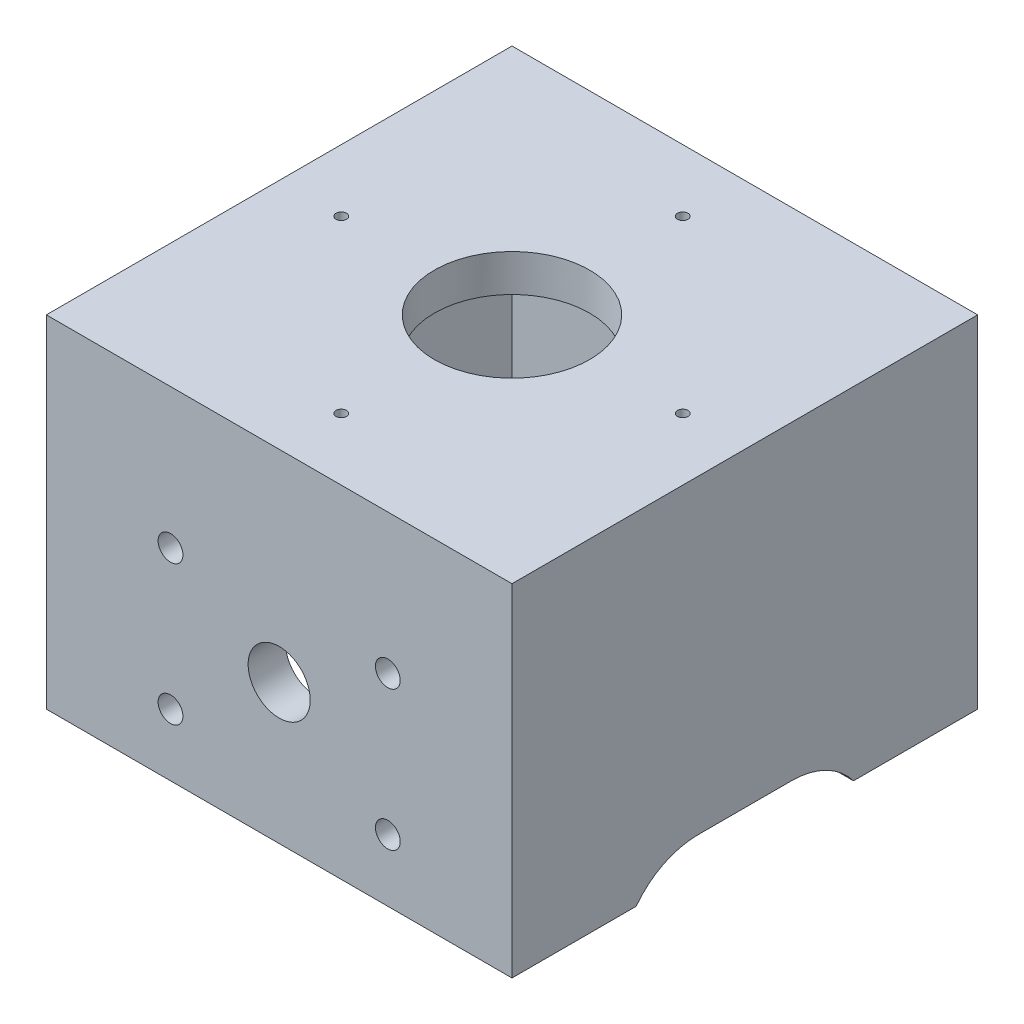
ISO-10303-21;
HEADER;
FILE_DESCRIPTION(('STEP AP214'),'2;1');
FILE_NAME('part.step','',(''),(''),'','','');
FILE_SCHEMA(('AUTOMOTIVE_DESIGN { 1 0 10303 214 1 1 1 1 }'));
ENDSEC;
DATA;
#1=APPLICATION_CONTEXT('core data for automotive mechanical design processes');
#2=APPLICATION_PROTOCOL_DEFINITION('international standard','automotive_design',2000,#1);
#3=PRODUCT_CONTEXT('',#1,'mechanical');
#4=PRODUCT('Part','Part','',(#3));
#5=PRODUCT_RELATED_PRODUCT_CATEGORY('part','',(#4));
#6=PRODUCT_DEFINITION_FORMATION('','',#4);
#7=PRODUCT_DEFINITION_CONTEXT('part definition',#1,'design');
#8=PRODUCT_DEFINITION('design','',#6,#7);
#9=PRODUCT_DEFINITION_SHAPE('','',#8);
#10=(LENGTH_UNIT() NAMED_UNIT(*) SI_UNIT(.MILLI.,.METRE.));
#11=(NAMED_UNIT(*) PLANE_ANGLE_UNIT() SI_UNIT($,.RADIAN.));
#12=(NAMED_UNIT(*) SI_UNIT($,.STERADIAN.) SOLID_ANGLE_UNIT());
#13=UNCERTAINTY_MEASURE_WITH_UNIT(LENGTH_MEASURE(1.E-05),#10,'distance_accuracy_value','');
#14=(GEOMETRIC_REPRESENTATION_CONTEXT(3) GLOBAL_UNCERTAINTY_ASSIGNED_CONTEXT((#13)) GLOBAL_UNIT_ASSIGNED_CONTEXT((#10,
#11,#12)) REPRESENTATION_CONTEXT('',''));
#15=CARTESIAN_POINT('',(0.,0.,0.));
#16=DIRECTION('',(0.,0.,1.));
#17=DIRECTION('',(1.,0.,0.));
#18=AXIS2_PLACEMENT_3D('',#15,#16,#17);
#19=CARTESIAN_POINT('',(0.,0.,0.));
#20=DIRECTION('',(0.,-1.,0.));
#21=DIRECTION('',(0.,0.,-1.));
#22=AXIS2_PLACEMENT_3D('',#19,#20,#21);
#23=PLANE('',#22);
#24=DIRECTION('',(-1.,0.,0.));
#25=VECTOR('',#24,1.);
#26=CARTESIAN_POINT('',(0.,0.,-150.));
#27=LINE('',#26,#25);
#28=CARTESIAN_POINT('',(40.,0.,-150.));
#29=VERTEX_POINT('',#28);
#30=CARTESIAN_POINT('',(0.,0.,-150.));
#31=VERTEX_POINT('',#30);
#32=EDGE_CURVE('E198',#29,#31,#27,.T.);
#33=ORIENTED_EDGE('',*,*,#32,.F.);
#34=DIRECTION('',(0.,0.,-1.));
#35=VECTOR('',#34,1.);
#36=CARTESIAN_POINT('',(40.,0.,-67.2893218813452));
#37=LINE('',#36,#35);
#38=CARTESIAN_POINT('',(40.,0.,-138.));
#39=VERTEX_POINT('',#38);
#40=EDGE_CURVE('E179',#39,#29,#37,.T.);
#41=ORIENTED_EDGE('',*,*,#40,.F.);
#42=DIRECTION('',(1.,0.,0.));
#43=VECTOR('',#42,1.);
#44=CARTESIAN_POINT('',(12.,0.,-138.));
#45=LINE('',#44,#43);
#46=CARTESIAN_POINT('',(12.,0.,-138.));
#47=VERTEX_POINT('',#46);
#48=EDGE_CURVE('E349',#47,#39,#45,.T.);
#49=ORIENTED_EDGE('',*,*,#48,.F.);
#50=DIRECTION('',(0.,0.,-1.));
#51=VECTOR('',#50,1.);
#52=CARTESIAN_POINT('',(12.,0.,-12.));
#53=LINE('',#52,#51);
#54=CARTESIAN_POINT('',(12.,0.,-110.));
#55=VERTEX_POINT('',#54);
#56=EDGE_CURVE('E261',#55,#47,#53,.T.);
#57=ORIENTED_EDGE('',*,*,#56,.F.);
#58=DIRECTION('',(-1.,0.,0.));
#59=VECTOR('',#58,1.);
#60=CARTESIAN_POINT('',(150.,0.,-110.));
#61=LINE('',#60,#59);
#62=CARTESIAN_POINT('',(0.,0.,-110.));
#63=VERTEX_POINT('',#62);
#64=EDGE_CURVE('E305',#55,#63,#61,.T.);
#65=ORIENTED_EDGE('',*,*,#64,.T.);
#66=DIRECTION('',(0.,0.,1.));
#67=VECTOR('',#66,1.);
#68=CARTESIAN_POINT('',(0.,0.,0.));
#69=LINE('',#68,#67);
#70=EDGE_CURVE('E209',#31,#63,#69,.T.);
#71=ORIENTED_EDGE('',*,*,#70,.F.);
#72=EDGE_LOOP('',(#33,#41,#49,#57,#65,#71));
#73=FACE_BOUND('',#72,.T.);
#74=ADVANCED_FACE('F41',(#73),#23,.T.);
#75=CARTESIAN_POINT('',(110.,0.,-138.));
#76=VERTEX_POINT('',#75);
#77=CARTESIAN_POINT('',(138.,0.,-138.));
#78=VERTEX_POINT('',#77);
#79=EDGE_CURVE('E348',#76,#78,#45,.T.);
#80=ORIENTED_EDGE('',*,*,#79,.F.);
#81=DIRECTION('',(0.,0.,-1.));
#82=VECTOR('',#81,1.);
#83=CARTESIAN_POINT('',(110.,0.,-67.2893218813452));
#84=LINE('',#83,#82);
#85=CARTESIAN_POINT('',(110.,0.,-150.));
#86=VERTEX_POINT('',#85);
#87=EDGE_CURVE('E193',#76,#86,#84,.T.);
#88=ORIENTED_EDGE('',*,*,#87,.T.);
#89=CARTESIAN_POINT('',(150.,0.,-150.));
#90=VERTEX_POINT('',#89);
#91=EDGE_CURVE('E211',#90,#86,#27,.T.);
#92=ORIENTED_EDGE('',*,*,#91,.F.);
#93=DIRECTION('',(0.,0.,-1.));
#94=VECTOR('',#93,1.);
#95=CARTESIAN_POINT('',(150.,0.,0.));
#96=LINE('',#95,#94);
#97=CARTESIAN_POINT('',(150.,0.,-110.));
#98=VERTEX_POINT('',#97);
#99=EDGE_CURVE('E219',#98,#90,#96,.T.);
#100=ORIENTED_EDGE('',*,*,#99,.F.);
#101=CARTESIAN_POINT('',(138.,0.,-110.));
#102=VERTEX_POINT('',#101);
#103=EDGE_CURVE('E303',#98,#102,#61,.T.);
#104=ORIENTED_EDGE('',*,*,#103,.T.);
#105=DIRECTION('',(0.,0.,1.));
#106=VECTOR('',#105,1.);
#107=CARTESIAN_POINT('',(138.,0.,-138.));
#108=LINE('',#107,#106);
#109=EDGE_CURVE('E353',#78,#102,#108,.T.);
#110=ORIENTED_EDGE('',*,*,#109,.F.);
#111=EDGE_LOOP('',(#80,#88,#92,#100,#104,#110));
#112=FACE_BOUND('',#111,.T.);
#113=ADVANCED_FACE('F405',(#112),#23,.T.);
#114=CARTESIAN_POINT('',(0.,110.,-150.));
#115=DIRECTION('',(0.,0.,1.));
#116=DIRECTION('',(1.,0.,0.));
#117=AXIS2_PLACEMENT_3D('',#114,#115,#116);
#118=PLANE('',#117);
#119=CARTESIAN_POINT('',(60.,-15.,-150.));
#120=DIRECTION('',(0.,0.,1.));
#121=DIRECTION('',(1.,0.,0.));
#122=AXIS2_PLACEMENT_3D('',#119,#120,#121);
#123=CIRCLE('',#122,25.);
#124=CARTESIAN_POINT('',(60.,9.99999999999999,-150.));
#125=VERTEX_POINT('',#124);
#126=EDGE_CURVE('E183',#125,#29,#123,.T.);
#127=ORIENTED_EDGE('',*,*,#126,.T.);
#128=ORIENTED_EDGE('',*,*,#32,.T.);
#129=DIRECTION('',(0.,-1.,0.));
#130=VECTOR('',#129,1.);
#131=CARTESIAN_POINT('',(0.,110.,-150.));
#132=LINE('',#131,#130);
#133=CARTESIAN_POINT('',(0.,110.,-150.));
#134=VERTEX_POINT('',#133);
#135=EDGE_CURVE('E223',#134,#31,#132,.T.);
#136=ORIENTED_EDGE('',*,*,#135,.F.);
#137=DIRECTION('',(-1.,0.,0.));
#138=VECTOR('',#137,1.);
#139=CARTESIAN_POINT('',(0.,110.,-150.));
#140=LINE('',#139,#138);
#141=CARTESIAN_POINT('',(150.,110.,-150.));
#142=VERTEX_POINT('',#141);
#143=EDGE_CURVE('E227',#142,#134,#140,.T.);
#144=ORIENTED_EDGE('',*,*,#143,.F.);
#145=DIRECTION('',(0.,-1.,0.));
#146=VECTOR('',#145,1.);
#147=CARTESIAN_POINT('',(150.,110.,-150.));
#148=LINE('',#147,#146);
#149=EDGE_CURVE('E226',#142,#90,#148,.T.);
#150=ORIENTED_EDGE('',*,*,#149,.T.);
#151=ORIENTED_EDGE('',*,*,#91,.T.);
#152=CARTESIAN_POINT('',(90.,-15.,-150.));
#153=DIRECTION('',(0.,0.,1.));
#154=DIRECTION('',(1.,0.,0.));
#155=AXIS2_PLACEMENT_3D('',#152,#153,#154);
#156=CIRCLE('',#155,25.);
#157=CARTESIAN_POINT('',(90.,10.,-150.));
#158=VERTEX_POINT('',#157);
#159=EDGE_CURVE('E203',#86,#158,#156,.T.);
#160=ORIENTED_EDGE('',*,*,#159,.T.);
#161=DIRECTION('',(1.,0.,0.));
#162=VECTOR('',#161,1.);
#163=CARTESIAN_POINT('',(0.,9.99999999999994,-150.));
#164=LINE('',#163,#162);
#165=EDGE_CURVE('E201',#125,#158,#164,.T.);
#166=ORIENTED_EDGE('',*,*,#165,.F.);
#167=EDGE_LOOP('',(#127,#128,#136,#144,#150,#151,#160,#166));
#168=FACE_BOUND('',#167,.T.);
#169=ADVANCED_FACE('F196',(#168),#118,.F.);
#170=CARTESIAN_POINT('',(12.,288.19090885901,-138.));
#171=DIRECTION('',(0.,0.,-1.));
#172=DIRECTION('',(-1.,0.,0.));
#173=AXIS2_PLACEMENT_3D('',#170,#171,#172);
#174=PLANE('',#173);
#175=CARTESIAN_POINT('',(60.,-15.,-138.));
#176=DIRECTION('',(0.,0.,-1.));
#177=DIRECTION('',(-1.,0.,0.));
#178=AXIS2_PLACEMENT_3D('',#175,#176,#177);
#179=CIRCLE('',#178,25.);
#180=CARTESIAN_POINT('',(60.,9.99999999999999,-138.));
#181=VERTEX_POINT('',#180);
#182=EDGE_CURVE('E186',#39,#181,#179,.T.);
#183=ORIENTED_EDGE('',*,*,#182,.T.);
#184=DIRECTION('',(-1.,0.,0.));
#185=VECTOR('',#184,1.);
#186=CARTESIAN_POINT('',(0.,9.99999999999994,-138.));
#187=LINE('',#186,#185);
#188=CARTESIAN_POINT('',(90.,10.,-138.));
#189=VERTEX_POINT('',#188);
#190=EDGE_CURVE('E416',#189,#181,#187,.T.);
#191=ORIENTED_EDGE('',*,*,#190,.F.);
#192=CARTESIAN_POINT('',(90.,-15.,-138.));
#193=DIRECTION('',(0.,0.,-1.));
#194=DIRECTION('',(-1.,0.,0.));
#195=AXIS2_PLACEMENT_3D('',#192,#193,#194);
#196=CIRCLE('',#195,25.);
#197=EDGE_CURVE('E192',#189,#76,#196,.T.);
#198=ORIENTED_EDGE('',*,*,#197,.T.);
#199=ORIENTED_EDGE('',*,*,#79,.T.);
#200=DIRECTION('',(0.,-1.,0.));
#201=VECTOR('',#200,1.);
#202=CARTESIAN_POINT('',(138.,288.19090885901,-138.));
#203=LINE('',#202,#201);
#204=CARTESIAN_POINT('',(138.,98.,-138.));
#205=VERTEX_POINT('',#204);
#206=EDGE_CURVE('E367',#205,#78,#203,.T.);
#207=ORIENTED_EDGE('',*,*,#206,.F.);
#208=DIRECTION('',(-1.,0.,0.));
#209=VECTOR('',#208,1.);
#210=CARTESIAN_POINT('',(12.,98.,-138.));
#211=LINE('',#210,#209);
#212=CARTESIAN_POINT('',(12.,98.,-138.));
#213=VERTEX_POINT('',#212);
#214=EDGE_CURVE('E343',#205,#213,#211,.T.);
#215=ORIENTED_EDGE('',*,*,#214,.T.);
#216=DIRECTION('',(0.,-1.,0.));
#217=VECTOR('',#216,1.);
#218=CARTESIAN_POINT('',(12.,288.19090885901,-138.));
#219=LINE('',#218,#217);
#220=EDGE_CURVE('E360',#213,#47,#219,.T.);
#221=ORIENTED_EDGE('',*,*,#220,.T.);
#222=ORIENTED_EDGE('',*,*,#48,.T.);
#223=EDGE_LOOP('',(#183,#191,#198,#199,#207,#215,#221,#222));
#224=FACE_BOUND('',#223,.T.);
#225=ADVANCED_FACE('F464',(#224),#174,.F.);
#226=CARTESIAN_POINT('',(0.,110.,0.));
#227=DIRECTION('',(1.,0.,0.));
#228=DIRECTION('',(0.,0.,-1.));
#229=AXIS2_PLACEMENT_3D('',#226,#227,#228);
#230=PLANE('',#229);
#231=ORIENTED_EDGE('',*,*,#70,.T.);
#232=CARTESIAN_POINT('',(0.,-15.,-90.));
#233=DIRECTION('',(-1.,0.,0.));
#234=DIRECTION('',(0.,0.,-1.));
#235=AXIS2_PLACEMENT_3D('',#232,#233,#234);
#236=CIRCLE('',#235,25.);
#237=CARTESIAN_POINT('',(0.,10.,-90.));
#238=VERTEX_POINT('',#237);
#239=EDGE_CURVE('E419',#238,#63,#236,.T.);
#240=ORIENTED_EDGE('',*,*,#239,.F.);
#241=DIRECTION('',(0.,0.,-1.));
#242=VECTOR('',#241,1.);
#243=CARTESIAN_POINT('',(0.,10.,-90.));
#244=LINE('',#243,#242);
#245=CARTESIAN_POINT('',(0.,10.,-60.));
#246=VERTEX_POINT('',#245);
#247=EDGE_CURVE('E295',#246,#238,#244,.T.);
#248=ORIENTED_EDGE('',*,*,#247,.F.);
#249=CARTESIAN_POINT('',(0.,-15.,-60.));
#250=DIRECTION('',(-1.,0.,0.));
#251=DIRECTION('',(0.,0.,1.));
#252=AXIS2_PLACEMENT_3D('',#249,#250,#251);
#253=CIRCLE('',#252,25.);
#254=CARTESIAN_POINT('',(0.,0.,-40.));
#255=VERTEX_POINT('',#254);
#256=EDGE_CURVE('E430',#255,#246,#253,.T.);
#257=ORIENTED_EDGE('',*,*,#256,.F.);
#258=CARTESIAN_POINT('',(0.,0.,0.));
#259=VERTEX_POINT('',#258);
#260=EDGE_CURVE('E376',#255,#259,#69,.T.);
#261=ORIENTED_EDGE('',*,*,#260,.T.);
#262=DIRECTION('',(0.,-1.,0.));
#263=VECTOR('',#262,1.);
#264=CARTESIAN_POINT('',(0.,110.,0.));
#265=LINE('',#264,#263);
#266=CARTESIAN_POINT('',(0.,110.,0.));
#267=VERTEX_POINT('',#266);
#268=EDGE_CURVE('E235',#267,#259,#265,.T.);
#269=ORIENTED_EDGE('',*,*,#268,.F.);
#270=DIRECTION('',(0.,0.,1.));
#271=VECTOR('',#270,1.);
#272=CARTESIAN_POINT('',(0.,110.,0.));
#273=LINE('',#272,#271);
#274=EDGE_CURVE('E217',#134,#267,#273,.T.);
#275=ORIENTED_EDGE('',*,*,#274,.F.);
#276=ORIENTED_EDGE('',*,*,#135,.T.);
#277=EDGE_LOOP('',(#231,#240,#248,#257,#261,#269,#275,#276));
#278=FACE_BOUND('',#277,.T.);
#279=ADVANCED_FACE('F43',(#278),#230,.F.);
#280=CARTESIAN_POINT('',(0.,110.,0.));
#281=DIRECTION('',(0.,0.,-1.));
#282=DIRECTION('',(-1.,0.,0.));
#283=AXIS2_PLACEMENT_3D('',#280,#281,#282);
#284=PLANE('',#283);
#285=CARTESIAN_POINT('',(40.,20.,0.));
#286=DIRECTION('',(0.,0.,1.));
#287=DIRECTION('',(1.,0.,0.));
#288=AXIS2_PLACEMENT_3D('',#285,#286,#287);
#289=CIRCLE('',#288,4.);
#290=CARTESIAN_POINT('',(44.,20.,0.));
#291=VERTEX_POINT('',#290);
#292=EDGE_CURVE('E508',#291,#291,#289,.T.);
#293=ORIENTED_EDGE('',*,*,#292,.F.);
#294=EDGE_LOOP('',(#293));
#295=FACE_BOUND('',#294,.T.);
#296=CARTESIAN_POINT('',(110.,20.,0.));
#297=DIRECTION('',(0.,0.,1.));
#298=DIRECTION('',(1.,0.,0.));
#299=AXIS2_PLACEMENT_3D('',#296,#297,#298);
#300=CIRCLE('',#299,4.00000000000001);
#301=CARTESIAN_POINT('',(114.,20.,0.));
#302=VERTEX_POINT('',#301);
#303=EDGE_CURVE('E512',#302,#302,#300,.T.);
#304=ORIENTED_EDGE('',*,*,#303,.F.);
#305=EDGE_LOOP('',(#304));
#306=FACE_BOUND('',#305,.T.);
#307=CARTESIAN_POINT('',(110.,65.,0.));
#308=DIRECTION('',(0.,0.,1.));
#309=DIRECTION('',(1.,0.,0.));
#310=AXIS2_PLACEMENT_3D('',#307,#308,#309);
#311=CIRCLE('',#310,3.99999999999998);
#312=CARTESIAN_POINT('',(114.,65.,0.));
#313=VERTEX_POINT('',#312);
#314=EDGE_CURVE('E516',#313,#313,#311,.T.);
#315=ORIENTED_EDGE('',*,*,#314,.F.);
#316=EDGE_LOOP('',(#315));
#317=FACE_BOUND('',#316,.T.);
#318=CARTESIAN_POINT('',(75.,45.,0.));
#319=DIRECTION('',(0.,0.,1.));
#320=DIRECTION('',(1.,0.,0.));
#321=AXIS2_PLACEMENT_3D('',#318,#319,#320);
#322=CIRCLE('',#321,9.99999999999999);
#323=CARTESIAN_POINT('',(85.,45.,0.));
#324=VERTEX_POINT('',#323);
#325=EDGE_CURVE('E520',#324,#324,#322,.T.);
#326=ORIENTED_EDGE('',*,*,#325,.F.);
#327=EDGE_LOOP('',(#326));
#328=FACE_BOUND('',#327,.T.);
#329=CARTESIAN_POINT('',(40.,65.,0.));
#330=DIRECTION('',(0.,0.,1.));
#331=DIRECTION('',(1.,0.,0.));
#332=AXIS2_PLACEMENT_3D('',#329,#330,#331);
#333=CIRCLE('',#332,4.00000000000001);
#334=CARTESIAN_POINT('',(44.,65.,0.));
#335=VERTEX_POINT('',#334);
#336=EDGE_CURVE('E523',#335,#335,#333,.T.);
#337=ORIENTED_EDGE('',*,*,#336,.F.);
#338=EDGE_LOOP('',(#337));
#339=FACE_BOUND('',#338,.T.);
#340=DIRECTION('',(1.,0.,0.));
#341=VECTOR('',#340,1.);
#342=CARTESIAN_POINT('',(0.,0.,0.));
#343=LINE('',#342,#341);
#344=CARTESIAN_POINT('',(150.,0.,0.));
#345=VERTEX_POINT('',#344);
#346=EDGE_CURVE('E389',#259,#345,#343,.T.);
#347=ORIENTED_EDGE('',*,*,#346,.T.);
#348=DIRECTION('',(0.,-1.,0.));
#349=VECTOR('',#348,1.);
#350=CARTESIAN_POINT('',(150.,110.,0.));
#351=LINE('',#350,#349);
#352=CARTESIAN_POINT('',(150.,110.,0.));
#353=VERTEX_POINT('',#352);
#354=EDGE_CURVE('E231',#353,#345,#351,.T.);
#355=ORIENTED_EDGE('',*,*,#354,.F.);
#356=DIRECTION('',(1.,0.,0.));
#357=VECTOR('',#356,1.);
#358=CARTESIAN_POINT('',(0.,110.,0.));
#359=LINE('',#358,#357);
#360=EDGE_CURVE('E380',#267,#353,#359,.T.);
#361=ORIENTED_EDGE('',*,*,#360,.F.);
#362=ORIENTED_EDGE('',*,*,#268,.T.);
#363=EDGE_LOOP('',(#347,#355,#361,#362));
#364=FACE_BOUND('',#363,.T.);
#365=ADVANCED_FACE('F478',(#295,#306,#317,#328,#339,#364),#284,.F.);
#366=CARTESIAN_POINT('',(150.,110.,0.));
#367=DIRECTION('',(-1.,0.,0.));
#368=DIRECTION('',(0.,0.,1.));
#369=AXIS2_PLACEMENT_3D('',#366,#367,#368);
#370=PLANE('',#369);
#371=DIRECTION('',(0.,0.,-1.));
#372=VECTOR('',#371,1.);
#373=CARTESIAN_POINT('',(150.,10.,-90.));
#374=LINE('',#373,#372);
#375=CARTESIAN_POINT('',(150.,10.,-60.));
#376=VERTEX_POINT('',#375);
#377=CARTESIAN_POINT('',(150.,10.,-90.));
#378=VERTEX_POINT('',#377);
#379=EDGE_CURVE('E426',#376,#378,#374,.T.);
#380=ORIENTED_EDGE('',*,*,#379,.T.);
#381=CARTESIAN_POINT('',(150.,-15.,-90.));
#382=DIRECTION('',(-1.,0.,0.));
#383=DIRECTION('',(0.,0.,-1.));
#384=AXIS2_PLACEMENT_3D('',#381,#382,#383);
#385=CIRCLE('',#384,25.);
#386=EDGE_CURVE('E282',#378,#98,#385,.T.);
#387=ORIENTED_EDGE('',*,*,#386,.T.);
#388=ORIENTED_EDGE('',*,*,#99,.T.);
#389=ORIENTED_EDGE('',*,*,#149,.F.);
#390=DIRECTION('',(0.,0.,-1.));
#391=VECTOR('',#390,1.);
#392=CARTESIAN_POINT('',(150.,110.,0.));
#393=LINE('',#392,#391);
#394=EDGE_CURVE('E383',#353,#142,#393,.T.);
#395=ORIENTED_EDGE('',*,*,#394,.F.);
#396=ORIENTED_EDGE('',*,*,#354,.T.);
#397=CARTESIAN_POINT('',(150.,0.,-40.));
#398=VERTEX_POINT('',#397);
#399=EDGE_CURVE('E212',#345,#398,#96,.T.);
#400=ORIENTED_EDGE('',*,*,#399,.T.);
#401=CARTESIAN_POINT('',(150.,-15.,-60.));
#402=DIRECTION('',(-1.,0.,0.));
#403=DIRECTION('',(0.,0.,1.));
#404=AXIS2_PLACEMENT_3D('',#401,#402,#403);
#405=CIRCLE('',#404,25.);
#406=EDGE_CURVE('E422',#398,#376,#405,.T.);
#407=ORIENTED_EDGE('',*,*,#406,.T.);
#408=EDGE_LOOP('',(#380,#387,#388,#389,#395,#396,#400,#407));
#409=FACE_BOUND('',#408,.T.);
#410=ADVANCED_FACE('F398',(#409),#370,.F.);
#411=CARTESIAN_POINT('',(0.,110.,0.));
#412=DIRECTION('',(0.,-1.,0.));
#413=DIRECTION('',(0.,0.,-1.));
#414=AXIS2_PLACEMENT_3D('',#411,#412,#413);
#415=PLANE('',#414);
#416=CARTESIAN_POINT('',(130.,110.,-75.));
#417=DIRECTION('',(0.,1.,0.));
#418=DIRECTION('',(0.,0.,1.));
#419=AXIS2_PLACEMENT_3D('',#416,#417,#418);
#420=CIRCLE('',#419,1.70000000000001);
#421=CARTESIAN_POINT('',(130.,110.,-73.2999999999999));
#422=VERTEX_POINT('',#421);
#423=EDGE_CURVE('E245',#422,#422,#420,.T.);
#424=ORIENTED_EDGE('',*,*,#423,.F.);
#425=EDGE_LOOP('',(#424));
#426=FACE_BOUND('',#425,.T.);
#427=CARTESIAN_POINT('',(75.,110.,-75.));
#428=DIRECTION('',(0.,1.,0.));
#429=DIRECTION('',(0.,0.,1.));
#430=AXIS2_PLACEMENT_3D('',#427,#428,#429);
#431=CIRCLE('',#430,25.);
#432=CARTESIAN_POINT('',(75.,110.,-50.));
#433=VERTEX_POINT('',#432);
#434=EDGE_CURVE('E314',#433,#433,#431,.T.);
#435=ORIENTED_EDGE('',*,*,#434,.F.);
#436=EDGE_LOOP('',(#435));
#437=FACE_BOUND('',#436,.T.);
#438=CARTESIAN_POINT('',(75.,110.,-19.9999999999999));
#439=DIRECTION('',(0.,1.,0.));
#440=DIRECTION('',(0.,0.,1.));
#441=AXIS2_PLACEMENT_3D('',#438,#439,#440);
#442=CIRCLE('',#441,1.7);
#443=CARTESIAN_POINT('',(75.,110.,-18.2999999999999));
#444=VERTEX_POINT('',#443);
#445=EDGE_CURVE('E319',#444,#444,#442,.T.);
#446=ORIENTED_EDGE('',*,*,#445,.F.);
#447=EDGE_LOOP('',(#446));
#448=FACE_BOUND('',#447,.T.);
#449=CARTESIAN_POINT('',(20.,110.,-75.));
#450=DIRECTION('',(0.,1.,0.));
#451=DIRECTION('',(0.,0.,1.));
#452=AXIS2_PLACEMENT_3D('',#449,#450,#451);
#453=CIRCLE('',#452,1.7);
#454=CARTESIAN_POINT('',(20.,110.,-73.3));
#455=VERTEX_POINT('',#454);
#456=EDGE_CURVE('E323',#455,#455,#453,.T.);
#457=ORIENTED_EDGE('',*,*,#456,.F.);
#458=EDGE_LOOP('',(#457));
#459=FACE_BOUND('',#458,.T.);
#460=CARTESIAN_POINT('',(75.,110.,-130.));
#461=DIRECTION('',(0.,1.,0.));
#462=DIRECTION('',(0.,0.,1.));
#463=AXIS2_PLACEMENT_3D('',#460,#461,#462);
#464=CIRCLE('',#463,1.7);
#465=CARTESIAN_POINT('',(75.,110.,-128.3));
#466=VERTEX_POINT('',#465);
#467=EDGE_CURVE('E318',#466,#466,#464,.T.);
#468=ORIENTED_EDGE('',*,*,#467,.F.);
#469=EDGE_LOOP('',(#468));
#470=FACE_BOUND('',#469,.T.);
#471=ORIENTED_EDGE('',*,*,#274,.T.);
#472=ORIENTED_EDGE('',*,*,#360,.T.);
#473=ORIENTED_EDGE('',*,*,#394,.T.);
#474=ORIENTED_EDGE('',*,*,#143,.T.);
#475=EDGE_LOOP('',(#471,#472,#473,#474));
#476=FACE_BOUND('',#475,.T.);
#477=ADVANCED_FACE('F481',(#426,#437,#448,#459,#470,#476),#415,.F.);
#478=DIRECTION('',(-1.,0.,0.));
#479=VECTOR('',#478,1.);
#480=CARTESIAN_POINT('',(150.,0.,-40.));
#481=LINE('',#480,#479);
#482=CARTESIAN_POINT('',(138.,0.,-40.));
#483=VERTEX_POINT('',#482);
#484=EDGE_CURVE('E299',#398,#483,#481,.T.);
#485=ORIENTED_EDGE('',*,*,#484,.F.);
#486=ORIENTED_EDGE('',*,*,#399,.F.);
#487=ORIENTED_EDGE('',*,*,#346,.F.);
#488=ORIENTED_EDGE('',*,*,#260,.F.);
#489=CARTESIAN_POINT('',(12.,0.,-40.));
#490=VERTEX_POINT('',#489);
#491=EDGE_CURVE('E302',#490,#255,#481,.T.);
#492=ORIENTED_EDGE('',*,*,#491,.F.);
#493=CARTESIAN_POINT('',(12.,0.,-12.));
#494=VERTEX_POINT('',#493);
#495=EDGE_CURVE('E344',#494,#490,#53,.T.);
#496=ORIENTED_EDGE('',*,*,#495,.F.);
#497=DIRECTION('',(-1.,0.,0.));
#498=VECTOR('',#497,1.);
#499=CARTESIAN_POINT('',(138.,0.,-12.));
#500=LINE('',#499,#498);
#501=CARTESIAN_POINT('',(138.,0.,-12.));
#502=VERTEX_POINT('',#501);
#503=EDGE_CURVE('E356',#502,#494,#500,.T.);
#504=ORIENTED_EDGE('',*,*,#503,.F.);
#505=EDGE_CURVE('E352',#483,#502,#108,.T.);
#506=ORIENTED_EDGE('',*,*,#505,.F.);
#507=EDGE_LOOP('',(#485,#486,#487,#488,#492,#496,#504,#506));
#508=FACE_BOUND('',#507,.T.);
#509=ADVANCED_FACE('F454',(#508),#23,.T.);
#510=CARTESIAN_POINT('',(12.,288.19090885901,-12.));
#511=DIRECTION('',(-1.,0.,0.));
#512=DIRECTION('',(0.,0.,1.));
#513=AXIS2_PLACEMENT_3D('',#510,#511,#512);
#514=PLANE('',#513);
#515=DIRECTION('',(0.,0.,-1.));
#516=VECTOR('',#515,1.);
#517=CARTESIAN_POINT('',(12.,10.,-12.));
#518=LINE('',#517,#516);
#519=CARTESIAN_POINT('',(12.,10.,-60.));
#520=VERTEX_POINT('',#519);
#521=CARTESIAN_POINT('',(12.,10.,-90.));
#522=VERTEX_POINT('',#521);
#523=EDGE_CURVE('E291',#520,#522,#518,.T.);
#524=ORIENTED_EDGE('',*,*,#523,.T.);
#525=CARTESIAN_POINT('',(12.,-15.,-90.));
#526=DIRECTION('',(-1.,0.,0.));
#527=DIRECTION('',(0.,0.,1.));
#528=AXIS2_PLACEMENT_3D('',#525,#526,#527);
#529=CIRCLE('',#528,25.);
#530=EDGE_CURVE('E310',#522,#55,#529,.T.);
#531=ORIENTED_EDGE('',*,*,#530,.T.);
#532=ORIENTED_EDGE('',*,*,#56,.T.);
#533=ORIENTED_EDGE('',*,*,#220,.F.);
#534=DIRECTION('',(0.,0.,1.));
#535=VECTOR('',#534,1.);
#536=CARTESIAN_POINT('',(12.,98.,-12.));
#537=LINE('',#536,#535);
#538=CARTESIAN_POINT('',(12.,98.,-12.));
#539=VERTEX_POINT('',#538);
#540=EDGE_CURVE('E340',#213,#539,#537,.T.);
#541=ORIENTED_EDGE('',*,*,#540,.T.);
#542=DIRECTION('',(0.,-1.,0.));
#543=VECTOR('',#542,1.);
#544=CARTESIAN_POINT('',(12.,288.19090885901,-12.));
#545=LINE('',#544,#543);
#546=EDGE_CURVE('E337',#539,#494,#545,.T.);
#547=ORIENTED_EDGE('',*,*,#546,.T.);
#548=ORIENTED_EDGE('',*,*,#495,.T.);
#549=CARTESIAN_POINT('',(12.,-15.,-60.));
#550=DIRECTION('',(-1.,0.,0.));
#551=DIRECTION('',(0.,0.,1.));
#552=AXIS2_PLACEMENT_3D('',#549,#550,#551);
#553=CIRCLE('',#552,25.);
#554=EDGE_CURVE('E285',#490,#520,#553,.T.);
#555=ORIENTED_EDGE('',*,*,#554,.T.);
#556=EDGE_LOOP('',(#524,#531,#532,#533,#541,#547,#548,#555));
#557=FACE_BOUND('',#556,.T.);
#558=ADVANCED_FACE('F462',(#557),#514,.F.);
#559=CARTESIAN_POINT('',(138.,288.19090885901,-12.));
#560=DIRECTION('',(0.,0.,1.));
#561=DIRECTION('',(1.,0.,0.));
#562=AXIS2_PLACEMENT_3D('',#559,#560,#561);
#563=PLANE('',#562);
#564=CARTESIAN_POINT('',(40.,20.,-12.));
#565=DIRECTION('',(0.,0.,1.));
#566=DIRECTION('',(1.,0.,0.));
#567=AXIS2_PLACEMENT_3D('',#564,#565,#566);
#568=CIRCLE('',#567,4.);
#569=CARTESIAN_POINT('',(44.,20.,-12.));
#570=VERTEX_POINT('',#569);
#571=EDGE_CURVE('E535',#570,#570,#568,.F.);
#572=ORIENTED_EDGE('',*,*,#571,.F.);
#573=EDGE_LOOP('',(#572));
#574=FACE_BOUND('',#573,.T.);
#575=CARTESIAN_POINT('',(110.,20.,-12.));
#576=DIRECTION('',(0.,0.,1.));
#577=DIRECTION('',(1.,0.,0.));
#578=AXIS2_PLACEMENT_3D('',#575,#576,#577);
#579=CIRCLE('',#578,4.00000000000001);
#580=CARTESIAN_POINT('',(114.,20.,-12.));
#581=VERTEX_POINT('',#580);
#582=EDGE_CURVE('E808',#581,#581,#579,.F.);
#583=ORIENTED_EDGE('',*,*,#582,.F.);
#584=EDGE_LOOP('',(#583));
#585=FACE_BOUND('',#584,.T.);
#586=CARTESIAN_POINT('',(110.,65.,-12.));
#587=DIRECTION('',(0.,0.,1.));
#588=DIRECTION('',(1.,0.,0.));
#589=AXIS2_PLACEMENT_3D('',#586,#587,#588);
#590=CIRCLE('',#589,3.99999999999998);
#591=CARTESIAN_POINT('',(114.,65.,-12.));
#592=VERTEX_POINT('',#591);
#593=EDGE_CURVE('E814',#592,#592,#590,.F.);
#594=ORIENTED_EDGE('',*,*,#593,.F.);
#595=EDGE_LOOP('',(#594));
#596=FACE_BOUND('',#595,.T.);
#597=CARTESIAN_POINT('',(75.,45.,-12.));
#598=DIRECTION('',(0.,0.,1.));
#599=DIRECTION('',(1.,0.,0.));
#600=AXIS2_PLACEMENT_3D('',#597,#598,#599);
#601=CIRCLE('',#600,9.99999999999999);
#602=CARTESIAN_POINT('',(85.,45.,-12.));
#603=VERTEX_POINT('',#602);
#604=EDGE_CURVE('E526',#603,#603,#601,.F.);
#605=ORIENTED_EDGE('',*,*,#604,.F.);
#606=EDGE_LOOP('',(#605));
#607=FACE_BOUND('',#606,.T.);
#608=CARTESIAN_POINT('',(40.,65.,-12.));
#609=DIRECTION('',(0.,0.,1.));
#610=DIRECTION('',(1.,0.,0.));
#611=AXIS2_PLACEMENT_3D('',#608,#609,#610);
#612=CIRCLE('',#611,4.00000000000001);
#613=CARTESIAN_POINT('',(44.,65.,-12.));
#614=VERTEX_POINT('',#613);
#615=EDGE_CURVE('E204',#614,#614,#612,.F.);
#616=ORIENTED_EDGE('',*,*,#615,.F.);
#617=EDGE_LOOP('',(#616));
#618=FACE_BOUND('',#617,.T.);
#619=DIRECTION('',(1.,0.,0.));
#620=VECTOR('',#619,1.);
#621=CARTESIAN_POINT('',(138.,98.,-12.));
#622=LINE('',#621,#620);
#623=CARTESIAN_POINT('',(138.,98.,-12.));
#624=VERTEX_POINT('',#623);
#625=EDGE_CURVE('E336',#539,#624,#622,.T.);
#626=ORIENTED_EDGE('',*,*,#625,.T.);
#627=DIRECTION('',(0.,-1.,0.));
#628=VECTOR('',#627,1.);
#629=CARTESIAN_POINT('',(138.,288.19090885901,-12.));
#630=LINE('',#629,#628);
#631=EDGE_CURVE('E363',#624,#502,#630,.T.);
#632=ORIENTED_EDGE('',*,*,#631,.T.);
#633=ORIENTED_EDGE('',*,*,#503,.T.);
#634=ORIENTED_EDGE('',*,*,#546,.F.);
#635=EDGE_LOOP('',(#626,#632,#633,#634));
#636=FACE_BOUND('',#635,.T.);
#637=ADVANCED_FACE('F475',(#574,#585,#596,#607,#618,#636),#563,.F.);
#638=CARTESIAN_POINT('',(138.,288.19090885901,-138.));
#639=DIRECTION('',(1.,0.,0.));
#640=DIRECTION('',(0.,0.,-1.));
#641=AXIS2_PLACEMENT_3D('',#638,#639,#640);
#642=PLANE('',#641);
#643=ORIENTED_EDGE('',*,*,#109,.T.);
#644=CARTESIAN_POINT('',(138.,-15.,-90.));
#645=DIRECTION('',(1.,0.,0.));
#646=DIRECTION('',(0.,0.,-1.));
#647=AXIS2_PLACEMENT_3D('',#644,#645,#646);
#648=CIRCLE('',#647,25.);
#649=CARTESIAN_POINT('',(138.,10.,-90.));
#650=VERTEX_POINT('',#649);
#651=EDGE_CURVE('E12',#102,#650,#648,.T.);
#652=ORIENTED_EDGE('',*,*,#651,.T.);
#653=DIRECTION('',(0.,0.,1.));
#654=VECTOR('',#653,1.);
#655=CARTESIAN_POINT('',(138.,10.,-138.));
#656=LINE('',#655,#654);
#657=CARTESIAN_POINT('',(138.,10.,-60.));
#658=VERTEX_POINT('',#657);
#659=EDGE_CURVE('E50',#650,#658,#656,.T.);
#660=ORIENTED_EDGE('',*,*,#659,.T.);
#661=CARTESIAN_POINT('',(138.,-15.,-60.));
#662=DIRECTION('',(1.,0.,0.));
#663=DIRECTION('',(0.,0.,-1.));
#664=AXIS2_PLACEMENT_3D('',#661,#662,#663);
#665=CIRCLE('',#664,25.);
#666=EDGE_CURVE('E239',#658,#483,#665,.T.);
#667=ORIENTED_EDGE('',*,*,#666,.T.);
#668=ORIENTED_EDGE('',*,*,#505,.T.);
#669=ORIENTED_EDGE('',*,*,#631,.F.);
#670=DIRECTION('',(0.,0.,-1.));
#671=VECTOR('',#670,1.);
#672=CARTESIAN_POINT('',(138.,98.,-138.));
#673=LINE('',#672,#671);
#674=EDGE_CURVE('E333',#624,#205,#673,.T.);
#675=ORIENTED_EDGE('',*,*,#674,.T.);
#676=ORIENTED_EDGE('',*,*,#206,.T.);
#677=EDGE_LOOP('',(#643,#652,#660,#667,#668,#669,#675,#676));
#678=FACE_BOUND('',#677,.T.);
#679=ADVANCED_FACE('F268',(#678),#642,.F.);
#680=CARTESIAN_POINT('',(0.,98.,0.));
#681=DIRECTION('',(0.,-1.,0.));
#682=DIRECTION('',(0.,0.,-1.));
#683=AXIS2_PLACEMENT_3D('',#680,#681,#682);
#684=PLANE('',#683);
#685=CARTESIAN_POINT('',(130.,98.,-75.));
#686=DIRECTION('',(0.,-1.,0.));
#687=DIRECTION('',(0.,0.,-1.));
#688=AXIS2_PLACEMENT_3D('',#685,#686,#687);
#689=CIRCLE('',#688,1.70000000000001);
#690=CARTESIAN_POINT('',(130.,98.,-76.7));
#691=VERTEX_POINT('',#690);
#692=EDGE_CURVE('E257',#691,#691,#689,.T.);
#693=ORIENTED_EDGE('',*,*,#692,.F.);
#694=EDGE_LOOP('',(#693));
#695=FACE_BOUND('',#694,.T.);
#696=CARTESIAN_POINT('',(75.,98.,-75.));
#697=DIRECTION('',(0.,-1.,0.));
#698=DIRECTION('',(0.,0.,-1.));
#699=AXIS2_PLACEMENT_3D('',#696,#697,#698);
#700=CIRCLE('',#699,25.);
#701=CARTESIAN_POINT('',(75.,98.,-100.));
#702=VERTEX_POINT('',#701);
#703=EDGE_CURVE('E253',#702,#702,#700,.T.);
#704=ORIENTED_EDGE('',*,*,#703,.F.);
#705=EDGE_LOOP('',(#704));
#706=FACE_BOUND('',#705,.T.);
#707=CARTESIAN_POINT('',(75.,98.,-19.9999999999999));
#708=DIRECTION('',(0.,-1.,0.));
#709=DIRECTION('',(0.,0.,-1.));
#710=AXIS2_PLACEMENT_3D('',#707,#708,#709);
#711=CIRCLE('',#710,1.7);
#712=CARTESIAN_POINT('',(75.,98.,-21.6999999999999));
#713=VERTEX_POINT('',#712);
#714=EDGE_CURVE('E249',#713,#713,#711,.T.);
#715=ORIENTED_EDGE('',*,*,#714,.F.);
#716=EDGE_LOOP('',(#715));
#717=FACE_BOUND('',#716,.T.);
#718=CARTESIAN_POINT('',(20.,98.,-75.));
#719=DIRECTION('',(0.,-1.,0.));
#720=DIRECTION('',(0.,0.,-1.));
#721=AXIS2_PLACEMENT_3D('',#718,#719,#720);
#722=CIRCLE('',#721,1.7);
#723=CARTESIAN_POINT('',(20.,98.,-76.7));
#724=VERTEX_POINT('',#723);
#725=EDGE_CURVE('E244',#724,#724,#722,.T.);
#726=ORIENTED_EDGE('',*,*,#725,.F.);
#727=EDGE_LOOP('',(#726));
#728=FACE_BOUND('',#727,.T.);
#729=CARTESIAN_POINT('',(75.,98.,-130.));
#730=DIRECTION('',(0.,-1.,0.));
#731=DIRECTION('',(0.,0.,-1.));
#732=AXIS2_PLACEMENT_3D('',#729,#730,#731);
#733=CIRCLE('',#732,1.7);
#734=CARTESIAN_POINT('',(75.,98.,-131.7));
#735=VERTEX_POINT('',#734);
#736=EDGE_CURVE('E240',#735,#735,#733,.T.);
#737=ORIENTED_EDGE('',*,*,#736,.F.);
#738=EDGE_LOOP('',(#737));
#739=FACE_BOUND('',#738,.T.);
#740=ORIENTED_EDGE('',*,*,#540,.F.);
#741=ORIENTED_EDGE('',*,*,#214,.F.);
#742=ORIENTED_EDGE('',*,*,#674,.F.);
#743=ORIENTED_EDGE('',*,*,#625,.F.);
#744=EDGE_LOOP('',(#740,#741,#742,#743));
#745=FACE_BOUND('',#744,.T.);
#746=ADVANCED_FACE('F471',(#695,#706,#717,#728,#739,#745),#684,.T.);
#747=CARTESIAN_POINT('',(75.,0.,-130.));
#748=DIRECTION('',(0.,1.,0.));
#749=DIRECTION('',(0.,0.,1.));
#750=AXIS2_PLACEMENT_3D('',#747,#748,#749);
#751=CYLINDRICAL_SURFACE('',#750,1.7);
#752=ORIENTED_EDGE('',*,*,#736,.T.);
#753=EDGE_LOOP('',(#752));
#754=FACE_BOUND('',#753,.T.);
#755=ORIENTED_EDGE('',*,*,#467,.T.);
#756=EDGE_LOOP('',(#755));
#757=FACE_BOUND('',#756,.T.);
#758=ADVANCED_FACE('F580',(#754,#757),#751,.F.);
#759=CARTESIAN_POINT('',(20.,0.,-75.));
#760=DIRECTION('',(0.,1.,0.));
#761=DIRECTION('',(0.,0.,1.));
#762=AXIS2_PLACEMENT_3D('',#759,#760,#761);
#763=CYLINDRICAL_SURFACE('',#762,1.7);
#764=ORIENTED_EDGE('',*,*,#725,.T.);
#765=EDGE_LOOP('',(#764));
#766=FACE_BOUND('',#765,.T.);
#767=ORIENTED_EDGE('',*,*,#456,.T.);
#768=EDGE_LOOP('',(#767));
#769=FACE_BOUND('',#768,.T.);
#770=ADVANCED_FACE('F575',(#766,#769),#763,.F.);
#771=CARTESIAN_POINT('',(75.,0.,-19.9999999999999));
#772=DIRECTION('',(0.,1.,0.));
#773=DIRECTION('',(0.,0.,1.));
#774=AXIS2_PLACEMENT_3D('',#771,#772,#773);
#775=CYLINDRICAL_SURFACE('',#774,1.7);
#776=ORIENTED_EDGE('',*,*,#714,.T.);
#777=EDGE_LOOP('',(#776));
#778=FACE_BOUND('',#777,.T.);
#779=ORIENTED_EDGE('',*,*,#445,.T.);
#780=EDGE_LOOP('',(#779));
#781=FACE_BOUND('',#780,.T.);
#782=ADVANCED_FACE('F572',(#778,#781),#775,.F.);
#783=CARTESIAN_POINT('',(75.,0.,-75.));
#784=DIRECTION('',(0.,1.,0.));
#785=DIRECTION('',(0.,0.,1.));
#786=AXIS2_PLACEMENT_3D('',#783,#784,#785);
#787=CYLINDRICAL_SURFACE('',#786,25.);
#788=ORIENTED_EDGE('',*,*,#703,.T.);
#789=EDGE_LOOP('',(#788));
#790=FACE_BOUND('',#789,.T.);
#791=ORIENTED_EDGE('',*,*,#434,.T.);
#792=EDGE_LOOP('',(#791));
#793=FACE_BOUND('',#792,.T.);
#794=ADVANCED_FACE('F570',(#790,#793),#787,.F.);
#795=CARTESIAN_POINT('',(130.,0.,-75.));
#796=DIRECTION('',(0.,1.,0.));
#797=DIRECTION('',(0.,0.,1.));
#798=AXIS2_PLACEMENT_3D('',#795,#796,#797);
#799=CYLINDRICAL_SURFACE('',#798,1.70000000000001);
#800=ORIENTED_EDGE('',*,*,#692,.T.);
#801=EDGE_LOOP('',(#800));
#802=FACE_BOUND('',#801,.T.);
#803=ORIENTED_EDGE('',*,*,#423,.T.);
#804=EDGE_LOOP('',(#803));
#805=FACE_BOUND('',#804,.T.);
#806=ADVANCED_FACE('F567',(#802,#805),#799,.F.);
#807=CARTESIAN_POINT('',(150.,-15.,-60.));
#808=DIRECTION('',(-1.,0.,0.));
#809=DIRECTION('',(0.,0.,1.));
#810=AXIS2_PLACEMENT_3D('',#807,#808,#809);
#811=CYLINDRICAL_SURFACE('',#810,25.);
#812=DIRECTION('',(-1.,0.,0.));
#813=VECTOR('',#812,1.);
#814=CARTESIAN_POINT('',(150.,10.,-60.));
#815=LINE('',#814,#813);
#816=EDGE_CURVE('E277',#376,#658,#815,.T.);
#817=ORIENTED_EDGE('',*,*,#816,.F.);
#818=ORIENTED_EDGE('',*,*,#406,.F.);
#819=ORIENTED_EDGE('',*,*,#484,.T.);
#820=ORIENTED_EDGE('',*,*,#666,.F.);
#821=EDGE_LOOP('',(#817,#818,#819,#820));
#822=FACE_BOUND('',#821,.T.);
#823=ADVANCED_FACE('F564',(#822),#811,.F.);
#824=CARTESIAN_POINT('',(150.,10.,-90.));
#825=DIRECTION('',(0.,1.,0.));
#826=DIRECTION('',(0.,0.,1.));
#827=AXIS2_PLACEMENT_3D('',#824,#825,#826);
#828=PLANE('',#827);
#829=DIRECTION('',(-1.,0.,0.));
#830=VECTOR('',#829,1.);
#831=CARTESIAN_POINT('',(150.,10.,-90.));
#832=LINE('',#831,#830);
#833=EDGE_CURVE('E275',#378,#650,#832,.T.);
#834=ORIENTED_EDGE('',*,*,#833,.F.);
#835=ORIENTED_EDGE('',*,*,#379,.F.);
#836=ORIENTED_EDGE('',*,*,#816,.T.);
#837=ORIENTED_EDGE('',*,*,#659,.F.);
#838=EDGE_LOOP('',(#834,#835,#836,#837));
#839=FACE_BOUND('',#838,.T.);
#840=ADVANCED_FACE('F273',(#839),#828,.F.);
#841=CARTESIAN_POINT('',(150.,-15.,-90.));
#842=DIRECTION('',(-1.,0.,0.));
#843=DIRECTION('',(0.,0.,1.));
#844=AXIS2_PLACEMENT_3D('',#841,#842,#843);
#845=CYLINDRICAL_SURFACE('',#844,25.);
#846=ORIENTED_EDGE('',*,*,#103,.F.);
#847=ORIENTED_EDGE('',*,*,#386,.F.);
#848=ORIENTED_EDGE('',*,*,#833,.T.);
#849=ORIENTED_EDGE('',*,*,#651,.F.);
#850=EDGE_LOOP('',(#846,#847,#848,#849));
#851=FACE_BOUND('',#850,.T.);
#852=ADVANCED_FACE('F279',(#851),#845,.F.);
#853=EDGE_CURVE('E286',#522,#238,#832,.T.);
#854=ORIENTED_EDGE('',*,*,#853,.T.);
#855=ORIENTED_EDGE('',*,*,#239,.T.);
#856=ORIENTED_EDGE('',*,*,#64,.F.);
#857=ORIENTED_EDGE('',*,*,#530,.F.);
#858=EDGE_LOOP('',(#854,#855,#856,#857));
#859=FACE_BOUND('',#858,.T.);
#860=ADVANCED_FACE('F442',(#859),#845,.F.);
#861=EDGE_CURVE('E65',#520,#246,#815,.T.);
#862=ORIENTED_EDGE('',*,*,#861,.T.);
#863=ORIENTED_EDGE('',*,*,#247,.T.);
#864=ORIENTED_EDGE('',*,*,#853,.F.);
#865=ORIENTED_EDGE('',*,*,#523,.F.);
#866=EDGE_LOOP('',(#862,#863,#864,#865));
#867=FACE_BOUND('',#866,.T.);
#868=ADVANCED_FACE('F439',(#867),#828,.F.);
#869=ORIENTED_EDGE('',*,*,#491,.T.);
#870=ORIENTED_EDGE('',*,*,#256,.T.);
#871=ORIENTED_EDGE('',*,*,#861,.F.);
#872=ORIENTED_EDGE('',*,*,#554,.F.);
#873=EDGE_LOOP('',(#869,#870,#871,#872));
#874=FACE_BOUND('',#873,.T.);
#875=ADVANCED_FACE('F448',(#874),#811,.F.);
#876=CARTESIAN_POINT('',(60.,-15.,-67.2893218813452));
#877=DIRECTION('',(0.,0.,-1.));
#878=DIRECTION('',(-1.,0.,0.));
#879=AXIS2_PLACEMENT_3D('',#876,#877,#878);
#880=CYLINDRICAL_SURFACE('',#879,25.);
#881=ORIENTED_EDGE('',*,*,#40,.T.);
#882=ORIENTED_EDGE('',*,*,#126,.F.);
#883=DIRECTION('',(0.,0.,-1.));
#884=VECTOR('',#883,1.);
#885=CARTESIAN_POINT('',(60.,9.99999999999999,-67.2893218813452));
#886=LINE('',#885,#884);
#887=EDGE_CURVE('E412',#181,#125,#886,.T.);
#888=ORIENTED_EDGE('',*,*,#887,.F.);
#889=ORIENTED_EDGE('',*,*,#182,.F.);
#890=EDGE_LOOP('',(#881,#882,#888,#889));
#891=FACE_BOUND('',#890,.T.);
#892=ADVANCED_FACE('F181',(#891),#880,.F.);
#893=CARTESIAN_POINT('',(90.,-15.,-67.2893218813452));
#894=DIRECTION('',(0.,0.,-1.));
#895=DIRECTION('',(-1.,0.,0.));
#896=AXIS2_PLACEMENT_3D('',#893,#894,#895);
#897=CYLINDRICAL_SURFACE('',#896,25.);
#898=DIRECTION('',(0.,0.,-1.));
#899=VECTOR('',#898,1.);
#900=CARTESIAN_POINT('',(90.,10.,-67.2893218813452));
#901=LINE('',#900,#899);
#902=EDGE_CURVE('E57',#189,#158,#901,.T.);
#903=ORIENTED_EDGE('',*,*,#902,.T.);
#904=ORIENTED_EDGE('',*,*,#159,.F.);
#905=ORIENTED_EDGE('',*,*,#87,.F.);
#906=ORIENTED_EDGE('',*,*,#197,.F.);
#907=EDGE_LOOP('',(#903,#904,#905,#906));
#908=FACE_BOUND('',#907,.T.);
#909=ADVANCED_FACE('F548',(#908),#897,.F.);
#910=CARTESIAN_POINT('',(0.,9.99999999999994,-67.2893218813452));
#911=DIRECTION('',(0.,1.,0.));
#912=DIRECTION('',(-1.,0.,0.));
#913=AXIS2_PLACEMENT_3D('',#910,#911,#912);
#914=PLANE('',#913);
#915=ORIENTED_EDGE('',*,*,#190,.T.);
#916=ORIENTED_EDGE('',*,*,#887,.T.);
#917=ORIENTED_EDGE('',*,*,#165,.T.);
#918=ORIENTED_EDGE('',*,*,#902,.F.);
#919=EDGE_LOOP('',(#915,#916,#917,#918));
#920=FACE_BOUND('',#919,.T.);
#921=ADVANCED_FACE('F546',(#920),#914,.F.);
#922=CARTESIAN_POINT('',(40.,65.,-40.2842712474619));
#923=DIRECTION('',(0.,0.,1.));
#924=DIRECTION('',(1.,0.,0.));
#925=AXIS2_PLACEMENT_3D('',#922,#923,#924);
#926=CYLINDRICAL_SURFACE('',#925,4.00000000000001);
#927=ORIENTED_EDGE('',*,*,#615,.T.);
#928=EDGE_LOOP('',(#927));
#929=FACE_BOUND('',#928,.T.);
#930=ORIENTED_EDGE('',*,*,#336,.T.);
#931=EDGE_LOOP('',(#930));
#932=FACE_BOUND('',#931,.T.);
#933=ADVANCED_FACE('F555',(#929,#932),#926,.F.);
#934=CARTESIAN_POINT('',(75.,45.,-40.2842712474619));
#935=DIRECTION('',(0.,0.,1.));
#936=DIRECTION('',(1.,0.,0.));
#937=AXIS2_PLACEMENT_3D('',#934,#935,#936);
#938=CYLINDRICAL_SURFACE('',#937,9.99999999999999);
#939=ORIENTED_EDGE('',*,*,#604,.T.);
#940=EDGE_LOOP('',(#939));
#941=FACE_BOUND('',#940,.T.);
#942=ORIENTED_EDGE('',*,*,#325,.T.);
#943=EDGE_LOOP('',(#942));
#944=FACE_BOUND('',#943,.T.);
#945=ADVANCED_FACE('F759',(#941,#944),#938,.F.);
#946=CARTESIAN_POINT('',(110.,65.,-40.2842712474619));
#947=DIRECTION('',(0.,0.,1.));
#948=DIRECTION('',(1.,0.,0.));
#949=AXIS2_PLACEMENT_3D('',#946,#947,#948);
#950=CYLINDRICAL_SURFACE('',#949,3.99999999999998);
#951=ORIENTED_EDGE('',*,*,#593,.T.);
#952=EDGE_LOOP('',(#951));
#953=FACE_BOUND('',#952,.T.);
#954=ORIENTED_EDGE('',*,*,#314,.T.);
#955=EDGE_LOOP('',(#954));
#956=FACE_BOUND('',#955,.T.);
#957=ADVANCED_FACE('F765',(#953,#956),#950,.F.);
#958=CARTESIAN_POINT('',(110.,20.,-40.2842712474619));
#959=DIRECTION('',(0.,0.,1.));
#960=DIRECTION('',(1.,0.,0.));
#961=AXIS2_PLACEMENT_3D('',#958,#959,#960);
#962=CYLINDRICAL_SURFACE('',#961,4.00000000000001);
#963=ORIENTED_EDGE('',*,*,#582,.T.);
#964=EDGE_LOOP('',(#963));
#965=FACE_BOUND('',#964,.T.);
#966=ORIENTED_EDGE('',*,*,#303,.T.);
#967=EDGE_LOOP('',(#966));
#968=FACE_BOUND('',#967,.T.);
#969=ADVANCED_FACE('F773',(#965,#968),#962,.F.);
#970=CARTESIAN_POINT('',(40.,20.,-40.2842712474619));
#971=DIRECTION('',(0.,0.,1.));
#972=DIRECTION('',(1.,0.,0.));
#973=AXIS2_PLACEMENT_3D('',#970,#971,#972);
#974=CYLINDRICAL_SURFACE('',#973,4.);
#975=ORIENTED_EDGE('',*,*,#571,.T.);
#976=EDGE_LOOP('',(#975));
#977=FACE_BOUND('',#976,.T.);
#978=ORIENTED_EDGE('',*,*,#292,.T.);
#979=EDGE_LOOP('',(#978));
#980=FACE_BOUND('',#979,.T.);
#981=ADVANCED_FACE('F781',(#977,#980),#974,.F.);
#982=CLOSED_SHELL('',(#74,#113,#169,#225,#279,#365,#410,#477,#509,#558,#637,#679,#746,#758,#770,
#782,#794,#806,#823,#840,#852,#860,#868,#875,#892,#909,#921,#933,#945,#957,#969,#981));
#983=MANIFOLD_SOLID_BREP('B2',#982);
#984=ADVANCED_BREP_SHAPE_REPRESENTATION('',(#18,#983),#14);
#985=SHAPE_DEFINITION_REPRESENTATION(#9,#984);
ENDSEC;
END-ISO-10303-21;
